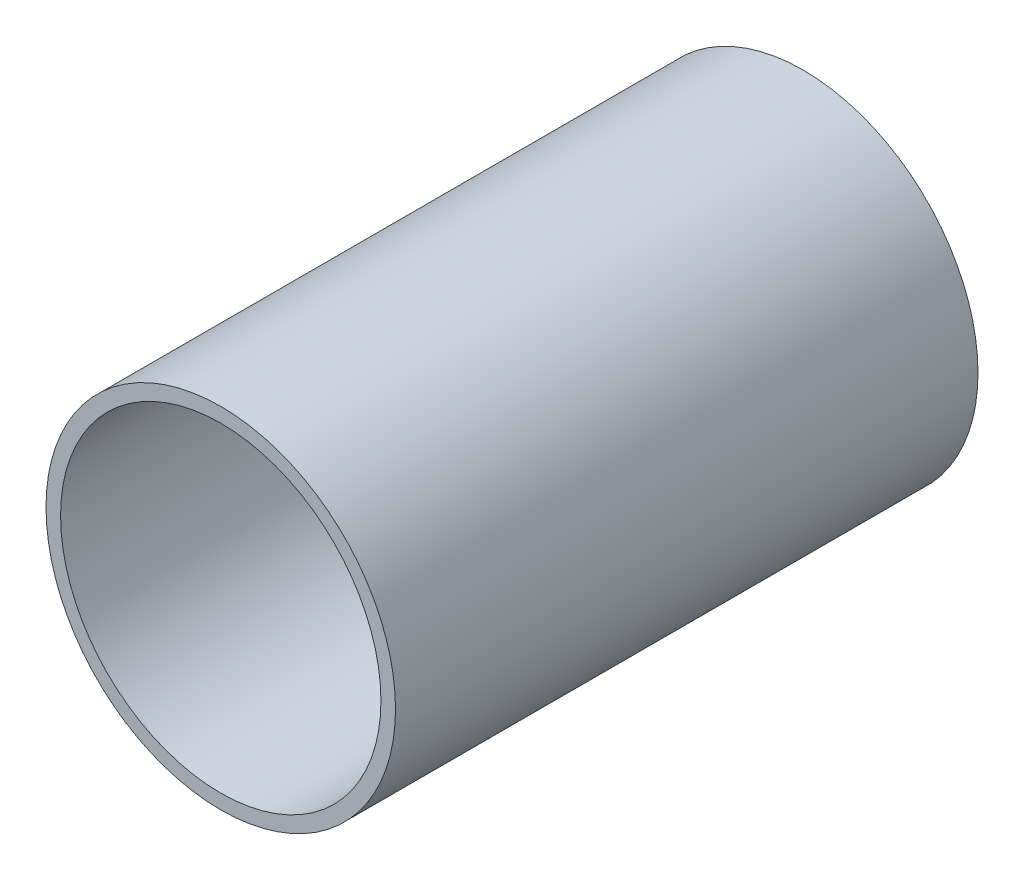
ISO-10303-21;
HEADER;
FILE_DESCRIPTION(('STEP AP214'),'2;1');
FILE_NAME('part.step','',(''),(''),'','','');
FILE_SCHEMA(('AUTOMOTIVE_DESIGN { 1 0 10303 214 1 1 1 1 }'));
ENDSEC;
DATA;
#1=APPLICATION_CONTEXT('core data for automotive mechanical design processes');
#2=APPLICATION_PROTOCOL_DEFINITION('international standard','automotive_design',2000,#1);
#3=PRODUCT_CONTEXT('',#1,'mechanical');
#4=PRODUCT('Part','Part','',(#3));
#5=PRODUCT_RELATED_PRODUCT_CATEGORY('part','',(#4));
#6=PRODUCT_DEFINITION_FORMATION('','',#4);
#7=PRODUCT_DEFINITION_CONTEXT('part definition',#1,'design');
#8=PRODUCT_DEFINITION('design','',#6,#7);
#9=PRODUCT_DEFINITION_SHAPE('','',#8);
#10=(LENGTH_UNIT() NAMED_UNIT(*) SI_UNIT(.MILLI.,.METRE.));
#11=(NAMED_UNIT(*) PLANE_ANGLE_UNIT() SI_UNIT($,.RADIAN.));
#12=(NAMED_UNIT(*) SI_UNIT($,.STERADIAN.) SOLID_ANGLE_UNIT());
#13=UNCERTAINTY_MEASURE_WITH_UNIT(LENGTH_MEASURE(1.E-05),#10,'distance_accuracy_value','');
#14=(GEOMETRIC_REPRESENTATION_CONTEXT(3) GLOBAL_UNCERTAINTY_ASSIGNED_CONTEXT((#13)) GLOBAL_UNIT_ASSIGNED_CONTEXT((#10,
#11,#12)) REPRESENTATION_CONTEXT('',''));
#15=CARTESIAN_POINT('',(0.,0.,0.));
#16=DIRECTION('',(0.,0.,1.));
#17=DIRECTION('',(1.,0.,0.));
#18=AXIS2_PLACEMENT_3D('',#15,#16,#17);
#19=CARTESIAN_POINT('',(0.,0.,80.));
#20=DIRECTION('',(0.,0.,-1.));
#21=DIRECTION('',(-1.,0.,0.));
#22=AXIS2_PLACEMENT_3D('',#19,#20,#21);
#23=CYLINDRICAL_SURFACE('',#22,24.);
#24=CARTESIAN_POINT('',(0.,0.,80.));
#25=DIRECTION('',(0.,0.,1.));
#26=DIRECTION('',(1.,0.,0.));
#27=AXIS2_PLACEMENT_3D('',#24,#25,#26);
#28=CIRCLE('',#27,24.);
#29=CARTESIAN_POINT('',(24.,0.,80.));
#30=VERTEX_POINT('',#29);
#31=EDGE_CURVE('E10',#30,#30,#28,.T.);
#32=ORIENTED_EDGE('',*,*,#31,.F.);
#33=EDGE_LOOP('',(#32));
#34=FACE_BOUND('',#33,.T.);
#35=CARTESIAN_POINT('',(0.,0.,0.));
#36=DIRECTION('',(0.,0.,1.));
#37=DIRECTION('',(1.,0.,0.));
#38=AXIS2_PLACEMENT_3D('',#35,#36,#37);
#39=CIRCLE('',#38,24.);
#40=CARTESIAN_POINT('',(24.,0.,0.));
#41=VERTEX_POINT('',#40);
#42=EDGE_CURVE('E35',#41,#41,#39,.T.);
#43=ORIENTED_EDGE('',*,*,#42,.T.);
#44=EDGE_LOOP('',(#43));
#45=FACE_BOUND('',#44,.T.);
#46=ADVANCED_FACE('F32',(#34,#45),#23,.T.);
#47=CARTESIAN_POINT('',(0.,0.,80.));
#48=DIRECTION('',(0.,0.,1.));
#49=DIRECTION('',(1.,0.,0.));
#50=AXIS2_PLACEMENT_3D('',#47,#48,#49);
#51=PLANE('',#50);
#52=CARTESIAN_POINT('',(0.,0.,80.));
#53=DIRECTION('',(0.,0.,1.));
#54=DIRECTION('',(1.,0.,0.));
#55=AXIS2_PLACEMENT_3D('',#52,#53,#54);
#56=CIRCLE('',#55,22.);
#57=CARTESIAN_POINT('',(22.,0.,80.));
#58=VERTEX_POINT('',#57);
#59=EDGE_CURVE('E44',#58,#58,#56,.T.);
#60=ORIENTED_EDGE('',*,*,#59,.F.);
#61=EDGE_LOOP('',(#60));
#62=FACE_BOUND('',#61,.T.);
#63=ORIENTED_EDGE('',*,*,#31,.T.);
#64=EDGE_LOOP('',(#63));
#65=FACE_BOUND('',#64,.T.);
#66=ADVANCED_FACE('F59',(#62,#65),#51,.T.);
#67=CARTESIAN_POINT('',(0.,0.,0.));
#68=DIRECTION('',(0.,0.,1.));
#69=DIRECTION('',(1.,0.,0.));
#70=AXIS2_PLACEMENT_3D('',#67,#68,#69);
#71=PLANE('',#70);
#72=CARTESIAN_POINT('',(0.,0.,0.));
#73=DIRECTION('',(0.,0.,1.));
#74=DIRECTION('',(1.,0.,0.));
#75=AXIS2_PLACEMENT_3D('',#72,#73,#74);
#76=CIRCLE('',#75,22.);
#77=CARTESIAN_POINT('',(22.,0.,0.));
#78=VERTEX_POINT('',#77);
#79=EDGE_CURVE('E42',#78,#78,#76,.T.);
#80=ORIENTED_EDGE('',*,*,#79,.T.);
#81=EDGE_LOOP('',(#80));
#82=FACE_BOUND('',#81,.T.);
#83=ORIENTED_EDGE('',*,*,#42,.F.);
#84=EDGE_LOOP('',(#83));
#85=FACE_BOUND('',#84,.T.);
#86=ADVANCED_FACE('F50',(#82,#85),#71,.F.);
#87=CARTESIAN_POINT('',(0.,0.,0.));
#88=DIRECTION('',(0.,0.,1.));
#89=DIRECTION('',(1.,0.,0.));
#90=AXIS2_PLACEMENT_3D('',#87,#88,#89);
#91=CYLINDRICAL_SURFACE('',#90,22.);
#92=ORIENTED_EDGE('',*,*,#79,.F.);
#93=EDGE_LOOP('',(#92));
#94=FACE_BOUND('',#93,.T.);
#95=ORIENTED_EDGE('',*,*,#59,.T.);
#96=EDGE_LOOP('',(#95));
#97=FACE_BOUND('',#96,.T.);
#98=ADVANCED_FACE('F53',(#94,#97),#91,.F.);
#99=CLOSED_SHELL('',(#46,#66,#86,#98));
#100=MANIFOLD_SOLID_BREP('B2',#99);
#101=ADVANCED_BREP_SHAPE_REPRESENTATION('',(#18,#100),#14);
#102=SHAPE_DEFINITION_REPRESENTATION(#9,#101);
ENDSEC;
END-ISO-10303-21;
